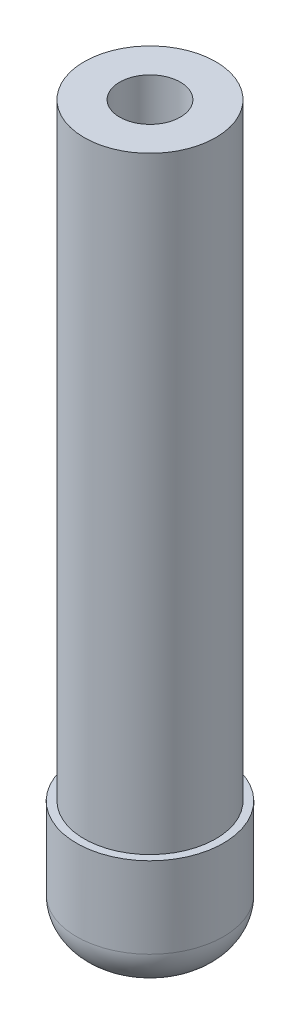
ISO-10303-21;
HEADER;
FILE_DESCRIPTION(('STEP AP214'),'2;1');
FILE_NAME('part.step','',(''),(''),'','','');
FILE_SCHEMA(('AUTOMOTIVE_DESIGN { 1 0 10303 214 1 1 1 1 }'));
ENDSEC;
DATA;
#1=APPLICATION_CONTEXT('core data for automotive mechanical design processes');
#2=APPLICATION_PROTOCOL_DEFINITION('international standard','automotive_design',2000,#1);
#3=PRODUCT_CONTEXT('',#1,'mechanical');
#4=PRODUCT('Part','Part','',(#3));
#5=PRODUCT_RELATED_PRODUCT_CATEGORY('part','',(#4));
#6=PRODUCT_DEFINITION_FORMATION('','',#4);
#7=PRODUCT_DEFINITION_CONTEXT('part definition',#1,'design');
#8=PRODUCT_DEFINITION('design','',#6,#7);
#9=PRODUCT_DEFINITION_SHAPE('','',#8);
#10=(LENGTH_UNIT() NAMED_UNIT(*) SI_UNIT(.MILLI.,.METRE.));
#11=(NAMED_UNIT(*) PLANE_ANGLE_UNIT() SI_UNIT($,.RADIAN.));
#12=(NAMED_UNIT(*) SI_UNIT($,.STERADIAN.) SOLID_ANGLE_UNIT());
#13=UNCERTAINTY_MEASURE_WITH_UNIT(LENGTH_MEASURE(1.E-05),#10,'distance_accuracy_value','');
#14=(GEOMETRIC_REPRESENTATION_CONTEXT(3) GLOBAL_UNCERTAINTY_ASSIGNED_CONTEXT((#13)) GLOBAL_UNIT_ASSIGNED_CONTEXT((#10,
#11,#12)) REPRESENTATION_CONTEXT('',''));
#15=CARTESIAN_POINT('',(0.,0.,0.));
#16=DIRECTION('',(0.,0.,1.));
#17=DIRECTION('',(1.,0.,0.));
#18=AXIS2_PLACEMENT_3D('',#15,#16,#17);
#19=CARTESIAN_POINT('',(0.,-10.,0.));
#20=DIRECTION('',(0.,1.,0.));
#21=DIRECTION('',(0.,0.,1.));
#22=AXIS2_PLACEMENT_3D('',#19,#20,#21);
#23=CYLINDRICAL_SURFACE('',#22,7.25);
#24=CARTESIAN_POINT('',(0.,0.,0.));
#25=DIRECTION('',(0.,-1.,0.));
#26=DIRECTION('',(0.,0.,-1.));
#27=AXIS2_PLACEMENT_3D('',#24,#25,#26);
#28=CIRCLE('',#27,7.25);
#29=CARTESIAN_POINT('',(0.,0.,-7.25));
#30=VERTEX_POINT('',#29);
#31=EDGE_CURVE('E100',#30,#30,#28,.T.);
#32=ORIENTED_EDGE('',*,*,#31,.T.);
#33=EDGE_LOOP('',(#32));
#34=FACE_BOUND('',#33,.T.);
#35=DIRECTION('',(0.,1.,0.));
#36=VECTOR('',#35,1.);
#37=CARTESIAN_POINT('',(2.,-10.,-6.96867993238318));
#38=LINE('',#37,#36);
#39=CARTESIAN_POINT('',(2.,-6.25,-6.96867993238318));
#40=VERTEX_POINT('',#39);
#41=CARTESIAN_POINT('',(2.00000008416036,-8.,-6.96852335366192));
#42=VERTEX_POINT('',#41);
#43=EDGE_CURVE('E95',#40,#42,#38,.F.);
#44=ORIENTED_EDGE('',*,*,#43,.F.);
#45=CARTESIAN_POINT('',(0.,-6.25,0.));
#46=DIRECTION('',(0.,1.,0.));
#47=DIRECTION('',(0.,0.,1.));
#48=AXIS2_PLACEMENT_3D('',#45,#46,#47);
#49=CIRCLE('',#48,7.25);
#50=CARTESIAN_POINT('',(-2.,-6.25,-6.96867993238318));
#51=VERTEX_POINT('',#50);
#52=EDGE_CURVE('E104',#51,#40,#49,.F.);
#53=ORIENTED_EDGE('',*,*,#52,.F.);
#54=DIRECTION('',(0.,1.,0.));
#55=VECTOR('',#54,1.);
#56=CARTESIAN_POINT('',(-2.,-10.,-6.96867993238318));
#57=LINE('',#56,#55);
#58=CARTESIAN_POINT('',(-2.00000008416675,-8.,-6.9685233536601));
#59=VERTEX_POINT('',#58);
#60=EDGE_CURVE('E115',#59,#51,#57,.T.);
#61=ORIENTED_EDGE('',*,*,#60,.F.);
#62=CARTESIAN_POINT('',(0.,-8.,-7.25));
#63=CARTESIAN_POINT('',(0.949022765797629,-8.,-7.25));
#64=CARTESIAN_POINT('',(1.89767217543963,-8.,-7.06130190011471));
#65=CARTESIAN_POINT('',(3.65123759385418,-8.,-6.33495132129895));
#66=CARTESIAN_POINT('',(4.45546373040692,-8.,-5.79758459679802));
#67=CARTESIAN_POINT('',(5.79758459679802,-8.,-4.45546373040692));
#68=CARTESIAN_POINT('',(6.3349513212989,-8.,-3.6512375938543));
#69=CARTESIAN_POINT('',(7.06130190011476,-8.,-1.89767217543949));
#70=CARTESIAN_POINT('',(7.25,-8.,-0.949022765797199));
#71=CARTESIAN_POINT('',(7.25,-8.,0.949022765797198));
#72=CARTESIAN_POINT('',(7.06130190011474,-8.,1.89767217543955));
#73=CARTESIAN_POINT('',(6.33495132129892,-8.,3.65123759385426));
#74=CARTESIAN_POINT('',(5.79758459679801,-8.,4.45546373040693));
#75=CARTESIAN_POINT('',(4.45546373040692,-8.,5.79758459679802));
#76=CARTESIAN_POINT('',(3.65123759385425,-8.,6.33495132129892));
#77=CARTESIAN_POINT('',(1.89767217543957,-8.,7.06130190011473));
#78=CARTESIAN_POINT('',(0.949022765797199,-8.,7.25));
#79=CARTESIAN_POINT('',(-0.949022765797197,-8.,7.25));
#80=CARTESIAN_POINT('',(-1.89767217543963,-8.,7.0613019001147));
#81=CARTESIAN_POINT('',(-3.65123759385415,-8.,6.33495132129896));
#82=CARTESIAN_POINT('',(-4.45546373040693,-8.,5.79758459679801));
#83=CARTESIAN_POINT('',(-5.79758459679802,-8.,4.45546373040692));
#84=CARTESIAN_POINT('',(-6.33495132129889,-8.,3.65123759385432));
#85=CARTESIAN_POINT('',(-7.06130190011476,-8.,1.89767217543951));
#86=CARTESIAN_POINT('',(-7.25,-8.,0.949022765797188));
#87=CARTESIAN_POINT('',(-7.25,-8.,-0.949022765797211));
#88=CARTESIAN_POINT('',(-7.06130190011474,-8.,-1.89767217543955));
#89=CARTESIAN_POINT('',(-6.33495132129893,-8.,-3.65123759385423));
#90=CARTESIAN_POINT('',(-5.79758459679803,-8.,-4.45546373040691));
#91=CARTESIAN_POINT('',(-4.45546373040694,-8.,-5.797584596798));
#92=CARTESIAN_POINT('',(-3.65123759385425,-8.,-6.33495132129892));
#93=CARTESIAN_POINT('',(-1.89767217543957,-8.,-7.06130190011473));
#94=CARTESIAN_POINT('',(-0.94902276579763,-8.,-7.25));
#95=CARTESIAN_POINT('',(0.,-8.,-7.25));
#96=(BOUNDED_CURVE() B_SPLINE_CURVE(3,(#62,#63,#64,#65,#66,#67,#68,#69,#70,#71,#72,#73,#74,#75,
#76,#77,#78,#79,#80,#81,#82,#83,#84,#85,#86,#87,#88,#89,#90,#91,#92,#93,#94,#95),.UNSPECIFIED.,
.T.,.F.) B_SPLINE_CURVE_WITH_KNOTS((4,2,2,2,2,2,2,2,2,2,2,2,2,2,2,2,4),(0.,0.392699081698724,
0.785398163397448,1.17809724509617,1.5707963267949,1.96349540849362,2.35619449019234,
2.74889357189107,3.14159265358979,3.53429173528852,3.92699081698724,4.31968989868597,
4.71238898038469,5.10508806208341,5.49778714378214,5.89048622548086,6.28318530717959),
.UNSPECIFIED.) CURVE() GEOMETRIC_REPRESENTATION_ITEM() RATIONAL_B_SPLINE_CURVE((1.,1.,1.,1.,1.,
1.,1.,1.,1.,1.,1.,1.,1.,1.,1.,1.,1.,1.,1.,1.,1.,1.,1.,1.,1.,1.,1.,1.,1.,1.,1.,1.,1.,1.)) REPRESENTATION_ITEM(''));
#97=EDGE_CURVE('E12',#59,#42,#96,.F.);
#98=ORIENTED_EDGE('',*,*,#97,.T.);
#99=EDGE_LOOP('',(#44,#53,#61,#98));
#100=FACE_BOUND('',#99,.T.);
#101=ADVANCED_FACE('F38',(#34,#100),#23,.T.);
#102=CARTESIAN_POINT('',(0.,-12.,-3.25));
#103=CARTESIAN_POINT('',(0.425423998461006,-12.,-3.25));
#104=CARTESIAN_POINT('',(0.850680630369499,-12.,-3.16541119660319));
#105=CARTESIAN_POINT('',(1.63676168000358,-12.,-2.83980576472018));
#106=CARTESIAN_POINT('',(1.9972768446652,-12.,-2.59891723304745));
#107=CARTESIAN_POINT('',(2.59891723304735,-12.,-1.99727684466511));
#108=CARTESIAN_POINT('',(2.83980576472021,-12.,-1.6367616800036));
#109=CARTESIAN_POINT('',(3.16541119660316,-12.,-0.850680630369477));
#110=CARTESIAN_POINT('',(3.25,-12.,-0.425423998460813));
#111=CARTESIAN_POINT('',(3.25,-12.,0.425423998460813));
#112=CARTESIAN_POINT('',(3.16541119660306,-12.,0.850680630369433));
#113=CARTESIAN_POINT('',(2.8398057647203,-12.,1.63676168000365));
#114=CARTESIAN_POINT('',(2.59891723304745,-12.,1.99727684466511));
#115=CARTESIAN_POINT('',(1.99727684466511,-12.,2.59891723304745));
#116=CARTESIAN_POINT('',(1.63676168000366,-12.,2.83980576472021));
#117=CARTESIAN_POINT('',(0.850680630369436,-12.,3.16541119660316));
#118=CARTESIAN_POINT('',(0.425423998460814,-12.,3.25));
#119=CARTESIAN_POINT('',(-0.425423998460813,-12.,3.25));
#120=CARTESIAN_POINT('',(-0.850680630369474,-12.,3.16541119660316));
#121=CARTESIAN_POINT('',(-1.6367616800036,-12.,2.83980576472021));
#122=CARTESIAN_POINT('',(-1.99727684466511,-12.,2.59891723304745));
#123=CARTESIAN_POINT('',(-2.59891723304745,-12.,1.99727684466511));
#124=CARTESIAN_POINT('',(-2.83980576472011,-12.,1.63676168000361));
#125=CARTESIAN_POINT('',(-3.16541119660325,-12.,0.850680630369482));
#126=CARTESIAN_POINT('',(-3.25,-12.,0.425423998460808));
#127=CARTESIAN_POINT('',(-3.25,-12.,-0.425423998460819));
#128=CARTESIAN_POINT('',(-3.16541119660316,-12.,-0.850680630369473));
#129=CARTESIAN_POINT('',(-2.83980576472021,-12.,-1.6367616800036));
#130=CARTESIAN_POINT('',(-2.59891723304736,-12.,-1.9972768446652));
#131=CARTESIAN_POINT('',(-1.99727684466521,-12.,-2.59891723304735));
#132=CARTESIAN_POINT('',(-1.63676168000361,-12.,-2.83980576472021));
#133=CARTESIAN_POINT('',(-0.850680630369482,-12.,-3.16541119660316));
#134=CARTESIAN_POINT('',(-0.425423998461007,-12.,-3.25));
#135=CARTESIAN_POINT('',(0.,-12.,-3.25));
#136=CARTESIAN_POINT('',(0.,-12.,-7.25));
#137=CARTESIAN_POINT('',(0.949022765797629,-12.0000000000007,-7.25000000000037));
#138=CARTESIAN_POINT('',(1.8976721754395,-12.,-7.06130190011464));
#139=CARTESIAN_POINT('',(3.6512375938543,-12.,-6.33495132129902));
#140=CARTESIAN_POINT('',(4.45546373040692,-12.,-5.79758459679802));
#141=CARTESIAN_POINT('',(5.79758459679802,-12.,-4.45546373040692));
#142=CARTESIAN_POINT('',(6.33495132129872,-12.,-3.65123759385423));
#143=CARTESIAN_POINT('',(7.06130190011494,-12.,-1.89767217543957));
#144=CARTESIAN_POINT('',(7.25,-12.,-0.949022765797199));
#145=CARTESIAN_POINT('',(7.25,-12.,0.949022765797198));
#146=CARTESIAN_POINT('',(7.06130190011457,-12.,1.89767217543948));
#147=CARTESIAN_POINT('',(6.33495132129909,-12.,3.65123759385433));
#148=CARTESIAN_POINT('',(5.79758459679801,-12.,4.45546373040693));
#149=CARTESIAN_POINT('',(4.45546373040692,-12.,5.79758459679802));
#150=CARTESIAN_POINT('',(3.65123759385424,-12.,6.3349513212989));
#151=CARTESIAN_POINT('',(1.89767217543958,-12.,7.06130190011475));
#152=CARTESIAN_POINT('',(0.949022765797199,-12.,7.25));
#153=CARTESIAN_POINT('',(-0.949022765797197,-12.,7.25));
#154=CARTESIAN_POINT('',(-1.89767217543974,-12.,7.06130190011494));
#155=CARTESIAN_POINT('',(-3.65123759385404,-12.,6.33495132129872));
#156=CARTESIAN_POINT('',(-4.45546373040693,-12.,5.79758459679801));
#157=CARTESIAN_POINT('',(-5.79758459679802,-12.,4.45546373040692));
#158=CARTESIAN_POINT('',(-6.33495132129835,-12.,3.65123759385424));
#159=CARTESIAN_POINT('',(-7.06130190011531,-12.,1.89767217543958));
#160=CARTESIAN_POINT('',(-7.25,-12.,0.949022765797188));
#161=CARTESIAN_POINT('',(-7.25,-12.,-0.949022765797211));
#162=CARTESIAN_POINT('',(-7.06130190011494,-12.,-1.89767217543956));
#163=CARTESIAN_POINT('',(-6.33495132129872,-12.,-3.65123759385422));
#164=CARTESIAN_POINT('',(-5.79758459679803,-12.,-4.45546373040691));
#165=CARTESIAN_POINT('',(-4.45546373040694,-12.,-5.797584596798));
#166=CARTESIAN_POINT('',(-3.65123759385424,-12.,-6.33495132129872));
#167=CARTESIAN_POINT('',(-1.89767217543958,-12.,-7.06130190011494));
#168=CARTESIAN_POINT('',(-0.94902276579763,-11.9999999999993,-7.24999999999963));
#169=CARTESIAN_POINT('',(0.,-12.,-7.25));
#170=CARTESIAN_POINT('',(0.,-8.,-7.25));
#171=CARTESIAN_POINT('',(0.949022765797629,-8.,-7.25));
#172=CARTESIAN_POINT('',(1.89767217543963,-8.,-7.06130190011471));
#173=CARTESIAN_POINT('',(3.65123759385418,-8.,-6.33495132129895));
#174=CARTESIAN_POINT('',(4.45546373040692,-8.,-5.79758459679802));
#175=CARTESIAN_POINT('',(5.79758459679802,-8.,-4.45546373040692));
#176=CARTESIAN_POINT('',(6.3349513212989,-8.,-3.6512375938543));
#177=CARTESIAN_POINT('',(7.06130190011476,-8.,-1.89767217543949));
#178=CARTESIAN_POINT('',(7.25,-8.,-0.949022765797199));
#179=CARTESIAN_POINT('',(7.25,-8.,0.949022765797198));
#180=CARTESIAN_POINT('',(7.06130190011474,-8.,1.89767217543955));
#181=CARTESIAN_POINT('',(6.33495132129892,-8.,3.65123759385426));
#182=CARTESIAN_POINT('',(5.79758459679801,-8.,4.45546373040693));
#183=CARTESIAN_POINT('',(4.45546373040692,-8.,5.79758459679802));
#184=CARTESIAN_POINT('',(3.65123759385425,-8.,6.33495132129892));
#185=CARTESIAN_POINT('',(1.89767217543957,-8.,7.06130190011473));
#186=CARTESIAN_POINT('',(0.949022765797199,-8.,7.25));
#187=CARTESIAN_POINT('',(-0.949022765797197,-8.,7.25));
#188=CARTESIAN_POINT('',(-1.89767217543963,-8.,7.0613019001147));
#189=CARTESIAN_POINT('',(-3.65123759385415,-8.,6.33495132129896));
#190=CARTESIAN_POINT('',(-4.45546373040693,-8.,5.79758459679801));
#191=CARTESIAN_POINT('',(-5.79758459679802,-8.,4.45546373040692));
#192=CARTESIAN_POINT('',(-6.33495132129889,-8.,3.65123759385432));
#193=CARTESIAN_POINT('',(-7.06130190011476,-8.,1.89767217543951));
#194=CARTESIAN_POINT('',(-7.25,-8.,0.949022765797188));
#195=CARTESIAN_POINT('',(-7.25,-8.,-0.949022765797211));
#196=CARTESIAN_POINT('',(-7.06130190011474,-8.,-1.89767217543955));
#197=CARTESIAN_POINT('',(-6.33495132129893,-8.,-3.65123759385423));
#198=CARTESIAN_POINT('',(-5.79758459679803,-8.,-4.45546373040691));
#199=CARTESIAN_POINT('',(-4.45546373040694,-8.,-5.797584596798));
#200=CARTESIAN_POINT('',(-3.65123759385425,-8.,-6.33495132129892));
#201=CARTESIAN_POINT('',(-1.89767217543957,-8.,-7.06130190011473));
#202=CARTESIAN_POINT('',(-0.94902276579763,-8.,-7.25));
#203=CARTESIAN_POINT('',(0.,-8.,-7.25));
#204=(BOUNDED_SURFACE() B_SPLINE_SURFACE(2,3,((#102,#103,#104,#105,#106,#107,#108,#109,#110,
#111,#112,#113,#114,#115,#116,#117,#118,#119,#120,#121,#122,#123,#124,#125,#126,#127,#128,#129,
#130,#131,#132,#133,#134,#135),(#136,#137,#138,#139,#140,#141,#142,#143,#144,#145,#146,#147,
#148,#149,#150,#151,#152,#153,#154,#155,#156,#157,#158,#159,#160,#161,#162,#163,#164,#165,#166,
#167,#168,#169),(#170,#171,#172,#173,#174,#175,#176,#177,#178,#179,#180,#181,#182,#183,#184,
#185,#186,#187,#188,#189,#190,#191,#192,#193,#194,#195,#196,#197,#198,#199,#200,#201,#202,
#203)),.UNSPECIFIED.,.F.,.T.,.F.) B_SPLINE_SURFACE_WITH_KNOTS((3,3),(4,2,2,2,2,2,2,2,2,2,2,2,2,
2,2,2,4),(0.,1.),(0.,0.392699081698724,0.785398163397448,1.17809724509617,1.5707963267949,
1.96349540849362,2.35619449019234,2.74889357189107,3.14159265358979,3.53429173528852,
3.92699081698724,4.31968989868597,4.71238898038469,5.10508806208341,5.49778714378214,
5.89048622548086,6.28318530717959),
.UNSPECIFIED.) GEOMETRIC_REPRESENTATION_ITEM() RATIONAL_B_SPLINE_SURFACE(((1.,1.,1.,1.,1.,1.,1.,
1.,1.,1.,1.,1.,1.,1.,1.,1.,1.,1.,1.,1.,1.,1.,1.,1.,1.,1.,1.,1.,1.,1.,1.,1.,1.,1.),
(0.666666666666667,0.666666666666667,0.666666666666667,0.666666666666667,0.666666666666667,
0.666666666666667,0.666666666666666,0.666666666666666,0.666666666666667,0.666666666666667,
0.666666666666667,0.666666666666667,0.666666666666666,0.666666666666666,0.666666666666667,
0.666666666666667,0.666666666666667,0.666666666666667,0.666666666666667,0.666666666666667,
0.666666666666666,0.666666666666666,0.666666666666667,0.666666666666667,0.666666666666666,
0.666666666666666,0.666666666666667,0.666666666666667,0.666666666666666,0.666666666666666,
0.666666666666667,0.666666666666667,0.666666666666667,0.666666666666667),(1.,1.,1.,1.,1.,1.,1.,
1.,1.,1.,1.,1.,1.,1.,1.,1.,1.,1.,1.,1.,1.,1.,1.,1.,1.,1.,1.,1.,1.,1.,1.,1.,1.,1.))) REPRESENTATION_ITEM('') SURFACE());
#205=CARTESIAN_POINT('',(0.,-12.,-3.25));
#206=CARTESIAN_POINT('',(-0.0531768229784522,-12.,-3.25000008603455));
#207=CARTESIAN_POINT('',(-0.106352582379698,-12.,-3.2486783641151));
#208=CARTESIAN_POINT('',(-0.212573677462247,-12.,-3.24341637998731));
#209=CARTESIAN_POINT('',(-0.265619015236641,-12.,-3.2394761600813));
#210=CARTESIAN_POINT('',(-0.371453651768639,-12.,-3.22900215948038));
#211=CARTESIAN_POINT('',(-0.424242945888606,-12.,-3.22246833198456));
#212=CARTESIAN_POINT('',(-0.529440623761362,-12.,-3.20683207879884));
#213=CARTESIAN_POINT('',(-0.581849000768205,-12.,-3.19772960773205));
#214=CARTESIAN_POINT('',(-0.686159759651296,-12.,-3.17698090988573));
#215=CARTESIAN_POINT('',(-0.738062141527544,-12.,-3.16533468310619));
#216=CARTESIAN_POINT('',(-0.841235876885507,-12.,-3.13952327660689));
#217=CARTESIAN_POINT('',(-0.89250724149908,-12.,-3.12535814139182));
#218=CARTESIAN_POINT('',(-0.994293846242282,-12.,-3.09453373941932));
#219=CARTESIAN_POINT('',(-1.04480909999964,-12.,-3.07787451767363));
#220=CARTESIAN_POINT('',(-1.1449585560669,-12.,-3.04208673531296));
#221=CARTESIAN_POINT('',(-1.19459274413019,-12.,-3.02295813481002));
#222=CARTESIAN_POINT('',(-1.2928495662429,-12.,-2.98225882651334));
#223=CARTESIAN_POINT('',(-1.34147220029233,-12.,-2.9606881187196));
#224=CARTESIAN_POINT('',(-1.43759434346581,-12.,-2.91517754269374));
#225=CARTESIAN_POINT('',(-1.48509387072103,-12.,-2.89123771274054));
#226=CARTESIAN_POINT('',(-1.57886401255567,-12.,-2.84105985832017));
#227=CARTESIAN_POINT('',(-1.62513460494325,-12.,-2.81482179238864));
#228=CARTESIAN_POINT('',(-1.71634087445363,-12.,-2.76011836367667));
#229=CARTESIAN_POINT('',(-1.76127652797832,-12.,-2.7316529615552));
#230=CARTESIAN_POINT('',(-1.84970691403401,-12.,-2.67256566664996));
#231=CARTESIAN_POINT('',(-1.89320164656501,-12.,-2.6419437738662));
#232=CARTESIAN_POINT('',(-1.97864415297975,-12.,-2.57861426408987));
#233=CARTESIAN_POINT('',(-2.02059195417925,-12.,-2.54590668395428));
#234=CARTESIAN_POINT('',(-2.10283452659361,-12.,-2.47847660271317));
#235=CARTESIAN_POINT('',(-2.14312932762409,-12.,-2.44375413797797));
#236=CARTESIAN_POINT('',(-2.2219599690053,-12.,-2.37236500071283));
#237=CARTESIAN_POINT('',(-2.2604957809294,-12.,-2.33569829678316));
#238=CARTESIAN_POINT('',(-2.33569829678317,-12.,-2.26049578092939));
#239=CARTESIAN_POINT('',(-2.37236500071284,-12.,-2.22195996900529));
#240=CARTESIAN_POINT('',(-2.44375413797799,-12.,-2.14312932762408));
#241=CARTESIAN_POINT('',(-2.47847660271318,-12.,-2.10283452659359));
#242=CARTESIAN_POINT('',(-2.54590668395429,-12.,-2.02059195417924));
#243=CARTESIAN_POINT('',(-2.57861426408988,-12.,-1.97864415297976));
#244=CARTESIAN_POINT('',(-2.64194377386621,-12.,-1.89320164656498));
#245=CARTESIAN_POINT('',(-2.67256566664996,-12.,-1.84970691403391));
#246=CARTESIAN_POINT('',(-2.73165296155521,-12.,-1.76127652797839));
#247=CARTESIAN_POINT('',(-2.76011836367672,-12.,-1.71634087445393));
#248=CARTESIAN_POINT('',(-2.81482179238861,-12.,-1.62513460494292));
#249=CARTESIAN_POINT('',(-2.84105985832001,-12.,-1.57886401255449));
#250=CARTESIAN_POINT('',(-2.89123771274071,-12.,-1.48509387072219));
#251=CARTESIAN_POINT('',(-2.91517754269435,-12.,-1.43759434347018));
#252=CARTESIAN_POINT('',(-2.96068811871899,-12.,-1.34147220028795));
#253=CARTESIAN_POINT('',(-2.98225882651106,-12.,-1.29284956622658));
#254=CARTESIAN_POINT('',(-3.02295813481231,-12.,-1.1945927441465));
#255=CARTESIAN_POINT('',(-3.0420867353215,-12.,-1.14495855612778));
#256=CARTESIAN_POINT('',(-3.07787451766511,-12.,-1.04480909993873));
#257=CARTESIAN_POINT('',(-3.09453373938748,-12.,-0.994293846014999));
#258=CARTESIAN_POINT('',(-3.12535814142366,-12.,-0.892507241726297));
#259=CARTESIAN_POINT('',(-3.13952327672572,-12.,-0.841235877733606));
#260=CARTESIAN_POINT('',(-3.16533468298736,-12.,-0.738062140679319));
#261=CARTESIAN_POINT('',(-3.17698090944223,-12.,-0.686159756485814));
#262=CARTESIAN_POINT('',(-3.19772960817556,-12.,-0.58184900393354));
#263=CARTESIAN_POINT('',(-3.20683208045401,-12.,-0.529440635574771));
#264=CARTESIAN_POINT('',(-3.22246833032942,-12.,-0.424242934075242));
#265=CARTESIAN_POINT('',(-3.22900215330336,-12.,-0.371453607681149));
#266=CARTESIAN_POINT('',(-3.23947616625822,-12.,-0.265619059323185));
#267=CARTESIAN_POINT('',(-3.24341640303967,-12.,-0.212573841994193));
#268=CARTESIAN_POINT('',(-3.24867834106237,-12.,-0.106352417845001));
#269=CARTESIAN_POINT('',(-3.25,-12.,-0.0531762089225033));
#270=CARTESIAN_POINT('',(-3.25,-12.,0.0531762089224933));
#271=CARTESIAN_POINT('',(-3.24867834106237,-12.,0.106352417844992));
#272=CARTESIAN_POINT('',(-3.24341640303968,-12.,0.212573841994185));
#273=CARTESIAN_POINT('',(-3.23947616625823,-12.,0.265619059323177));
#274=CARTESIAN_POINT('',(-3.22900215330337,-12.,0.371453607681143));
#275=CARTESIAN_POINT('',(-3.22246833032944,-12.,0.424242934075237));
#276=CARTESIAN_POINT('',(-3.20683208045404,-12.,0.529440635574768));
#277=CARTESIAN_POINT('',(-3.19772960817559,-12.,0.581849003933538));
#278=CARTESIAN_POINT('',(-3.17698090944227,-12.,0.686159756485815));
#279=CARTESIAN_POINT('',(-3.1653346829874,-12.,0.738062140679322));
#280=CARTESIAN_POINT('',(-3.13952327672576,-12.,0.84123587773361));
#281=CARTESIAN_POINT('',(-3.1253581414237,-12.,0.892507241726303));
#282=CARTESIAN_POINT('',(-3.09453373938752,-12.,0.994293846015007));
#283=CARTESIAN_POINT('',(-3.07787451766514,-12.,1.04480909993873));
#284=CARTESIAN_POINT('',(-3.04208673532151,-12.,1.14495855612779));
#285=CARTESIAN_POINT('',(-3.02295813481232,-12.,1.1945927441465));
#286=CARTESIAN_POINT('',(-2.98225882651104,-12.,1.29284956622659));
#287=CARTESIAN_POINT('',(-2.96068811871897,-12.,1.34147220028796));
#288=CARTESIAN_POINT('',(-2.91517754269432,-12.,1.43759434347018));
#289=CARTESIAN_POINT('',(-2.89123771274068,-12.,1.48509387072219));
#290=CARTESIAN_POINT('',(-2.84105985831998,-12.,1.57886401255448));
#291=CARTESIAN_POINT('',(-2.81482179238858,-12.,1.62513460494291));
#292=CARTESIAN_POINT('',(-2.7601183636767,-12.,1.71634087445391));
#293=CARTESIAN_POINT('',(-2.7316529615552,-12.,1.76127652797836));
#294=CARTESIAN_POINT('',(-2.67256566664996,-12.,1.84970691403388));
#295=CARTESIAN_POINT('',(-2.64194377386621,-12.,1.89320164656494));
#296=CARTESIAN_POINT('',(-2.57861426408989,-12.,1.97864415297973));
#297=CARTESIAN_POINT('',(-2.54590668395431,-12.,2.02059195417921));
#298=CARTESIAN_POINT('',(-2.4784766027132,-12.,2.10283452659356));
#299=CARTESIAN_POINT('',(-2.443754137978,-12.,2.14312932762405));
#300=CARTESIAN_POINT('',(-2.37236500071285,-12.,2.22195996900527));
#301=CARTESIAN_POINT('',(-2.33569829678317,-12.,2.26049578092938));
#302=CARTESIAN_POINT('',(-2.26049578092939,-12.,2.33569829678317));
#303=CARTESIAN_POINT('',(-2.22195996900528,-12.,2.37236500071285));
#304=CARTESIAN_POINT('',(-2.14312932762405,-12.,2.44375413797801));
#305=CARTESIAN_POINT('',(-2.10283452659356,-12.,2.47847660271321));
#306=CARTESIAN_POINT('',(-2.02059195417921,-12.,2.54590668395432));
#307=CARTESIAN_POINT('',(-1.97864415297973,-12.,2.57861426408991));
#308=CARTESIAN_POINT('',(-1.89320164656494,-12.,2.64194377386624));
#309=CARTESIAN_POINT('',(-1.84970691403388,-12.,2.67256566664999));
#310=CARTESIAN_POINT('',(-1.76127652797836,-12.,2.73165296155524));
#311=CARTESIAN_POINT('',(-1.71634087445391,-12.,2.76011836367674));
#312=CARTESIAN_POINT('',(-1.6251346049429,-12.,2.81482179238862));
#313=CARTESIAN_POINT('',(-1.57886401255448,-12.,2.84105985832003));
#314=CARTESIAN_POINT('',(-1.48509387072218,-12.,2.89123771274072));
#315=CARTESIAN_POINT('',(-1.43759434347017,-12.,2.91517754269436));
#316=CARTESIAN_POINT('',(-1.34147220028795,-12.,2.96068811871899));
#317=CARTESIAN_POINT('',(-1.29284956622658,-12.,2.98225882651106));
#318=CARTESIAN_POINT('',(-1.1945927441465,-12.,3.02295813481231));
#319=CARTESIAN_POINT('',(-1.14495855612779,-12.,3.0420867353215));
#320=CARTESIAN_POINT('',(-1.04480909993873,-12.,3.07787451766511));
#321=CARTESIAN_POINT('',(-0.994293846015,-12.,3.09453373938748));
#322=CARTESIAN_POINT('',(-0.892507241726297,-12.,3.12535814142366));
#323=CARTESIAN_POINT('',(-0.841235877733606,-12.,3.13952327672572));
#324=CARTESIAN_POINT('',(-0.738062140679318,-12.,3.16533468298736));
#325=CARTESIAN_POINT('',(-0.686159756485813,-12.,3.17698090944223));
#326=CARTESIAN_POINT('',(-0.581849003933537,-12.,3.19772960817556));
#327=CARTESIAN_POINT('',(-0.529440635574768,-12.,3.20683208045401));
#328=CARTESIAN_POINT('',(-0.424242934075238,-12.,3.22246833032942));
#329=CARTESIAN_POINT('',(-0.371453607681146,-12.,3.22900215330336));
#330=CARTESIAN_POINT('',(-0.265619059323182,-12.,3.23947616625822));
#331=CARTESIAN_POINT('',(-0.212573841994189,-12.,3.24341640303967));
#332=CARTESIAN_POINT('',(-0.106352417844996,-12.,3.24867834106237));
#333=CARTESIAN_POINT('',(-0.0531762089224979,-12.,3.25));
#334=CARTESIAN_POINT('',(0.0531762089224982,-12.,3.25));
#335=CARTESIAN_POINT('',(0.106352417844996,-12.,3.24867834106237));
#336=CARTESIAN_POINT('',(0.212573841994187,-12.,3.24341640303967));
#337=CARTESIAN_POINT('',(0.265619059323178,-12.,3.23947616625822));
#338=CARTESIAN_POINT('',(0.37145360768114,-12.,3.22900215330335));
#339=CARTESIAN_POINT('',(0.424242934075231,-12.,3.22246833032942));
#340=CARTESIAN_POINT('',(0.529440635574758,-12.,3.20683208045401));
#341=CARTESIAN_POINT('',(0.581849003933526,-12.,3.19772960817556));
#342=CARTESIAN_POINT('',(0.6861597564858,-12.,3.17698090944223));
#343=CARTESIAN_POINT('',(0.738062140679305,-12.,3.16533468298736));
#344=CARTESIAN_POINT('',(0.841235877733592,-12.,3.13952327672572));
#345=CARTESIAN_POINT('',(0.892507241726285,-12.,3.12535814142366));
#346=CARTESIAN_POINT('',(0.99429384601499,-12.,3.09453373938748));
#347=CARTESIAN_POINT('',(1.04480909993872,-12.,3.0778745176651));
#348=CARTESIAN_POINT('',(1.14495855612779,-12.,3.04208673532149));
#349=CARTESIAN_POINT('',(1.1945927441465,-12.,3.02295813481231));
#350=CARTESIAN_POINT('',(1.29284956622659,-12.,2.98225882651106));
#351=CARTESIAN_POINT('',(1.34147220028797,-12.,2.96068811871899));
#352=CARTESIAN_POINT('',(1.43759434347019,-12.,2.91517754269436));
#353=CARTESIAN_POINT('',(1.48509387072221,-12.,2.89123771274071));
#354=CARTESIAN_POINT('',(1.5788640125545,-12.,2.84105985832002));
#355=CARTESIAN_POINT('',(1.62513460494293,-12.,2.81482179238862));
#356=CARTESIAN_POINT('',(1.71634087445393,-12.,2.76011836367674));
#357=CARTESIAN_POINT('',(1.76127652797838,-12.,2.73165296155524));
#358=CARTESIAN_POINT('',(1.8497069140339,-12.,2.67256566664999));
#359=CARTESIAN_POINT('',(1.89320164656496,-12.,2.64194377386624));
#360=CARTESIAN_POINT('',(1.97864415297974,-12.,2.57861426408992));
#361=CARTESIAN_POINT('',(2.02059195417921,-12.,2.54590668395433));
#362=CARTESIAN_POINT('',(2.10283452659356,-12.,2.47847660271321));
#363=CARTESIAN_POINT('',(2.14312932762405,-12.,2.44375413797801));
#364=CARTESIAN_POINT('',(2.22195996900527,-12.,2.37236500071285));
#365=CARTESIAN_POINT('',(2.26049578092938,-12.,2.33569829678317));
#366=CARTESIAN_POINT('',(2.33569829678317,-12.,2.26049578092939));
#367=CARTESIAN_POINT('',(2.37236500071285,-12.,2.22195996900528));
#368=CARTESIAN_POINT('',(2.44375413797801,-12.,2.14312932762406));
#369=CARTESIAN_POINT('',(2.47847660271322,-12.,2.10283452659357));
#370=CARTESIAN_POINT('',(2.54590668395434,-12.,2.02059195417922));
#371=CARTESIAN_POINT('',(2.57861426408993,-12.,1.97864415297974));
#372=CARTESIAN_POINT('',(2.64194377386627,-12.,1.89320164656496));
#373=CARTESIAN_POINT('',(2.67256566665002,-12.,1.8497069140339));
#374=CARTESIAN_POINT('',(2.73165296155528,-12.,1.76127652797838));
#375=CARTESIAN_POINT('',(2.76011836367678,-12.,1.71634087445393));
#376=CARTESIAN_POINT('',(2.81482179238866,-12.,1.62513460494293));
#377=CARTESIAN_POINT('',(2.84105985832007,-12.,1.5788640125545));
#378=CARTESIAN_POINT('',(2.89123771274075,-12.,1.4850938707222));
#379=CARTESIAN_POINT('',(2.91517754269439,-12.,1.43759434347019));
#380=CARTESIAN_POINT('',(2.96068811871901,-12.,1.34147220028796));
#381=CARTESIAN_POINT('',(2.98225882651107,-12.,1.29284956622659));
#382=CARTESIAN_POINT('',(3.0229581348123,-12.,1.1945927441465));
#383=CARTESIAN_POINT('',(3.04208673532147,-12.,1.14495855612778));
#384=CARTESIAN_POINT('',(3.07787451766507,-12.,1.04480909993872));
#385=CARTESIAN_POINT('',(3.09453373938744,-12.,0.994293846014987));
#386=CARTESIAN_POINT('',(3.12535814142362,-12.,0.892507241726282));
#387=CARTESIAN_POINT('',(3.13952327672568,-12.,0.841235877733589));
#388=CARTESIAN_POINT('',(3.16533468298732,-12.,0.738062140679302));
#389=CARTESIAN_POINT('',(3.17698090944219,-12.,0.686159756485797));
#390=CARTESIAN_POINT('',(3.19772960817553,-12.,0.581849003933524));
#391=CARTESIAN_POINT('',(3.20683208045398,-12.,0.529440635574756));
#392=CARTESIAN_POINT('',(3.2224683303294,-12.,0.424242934075229));
#393=CARTESIAN_POINT('',(3.22900215330334,-12.,0.371453607681139));
#394=CARTESIAN_POINT('',(3.23947616625821,-12.,0.265619059323178));
#395=CARTESIAN_POINT('',(3.24341640303967,-12.,0.212573841994187));
#396=CARTESIAN_POINT('',(3.24867834106236,-12.,0.106352417844996));
#397=CARTESIAN_POINT('',(3.25,-12.,0.0531762089224978));
#398=CARTESIAN_POINT('',(3.25,-12.,-0.0531762089224988));
#399=CARTESIAN_POINT('',(3.24867834106237,-12.,-0.106352417844997));
#400=CARTESIAN_POINT('',(3.24341640303967,-12.,-0.21257384199419));
#401=CARTESIAN_POINT('',(3.23947616625822,-12.,-0.265619059323183));
#402=CARTESIAN_POINT('',(3.22900215330336,-12.,-0.371453607681147));
#403=CARTESIAN_POINT('',(3.22246833032942,-12.,-0.424242934075239));
#404=CARTESIAN_POINT('',(3.20683208045401,-12.,-0.529440635574769));
#405=CARTESIAN_POINT('',(3.19772960817556,-12.,-0.581849003933538));
#406=CARTESIAN_POINT('',(3.17698090944223,-12.,-0.686159756485814));
#407=CARTESIAN_POINT('',(3.16533468298736,-12.,-0.73806214067932));
#408=CARTESIAN_POINT('',(3.13952327672572,-12.,-0.841235877733608));
#409=CARTESIAN_POINT('',(3.12535814142366,-12.,-0.8925072417263));
#410=CARTESIAN_POINT('',(3.09453373938748,-12.,-0.994293846015003));
#411=CARTESIAN_POINT('',(3.0778745176651,-12.,-1.04480909993873));
#412=CARTESIAN_POINT('',(3.04208673532149,-12.,-1.14495855612779));
#413=CARTESIAN_POINT('',(3.02295813481231,-12.,-1.1945927441465));
#414=CARTESIAN_POINT('',(2.98225882651106,-12.,-1.29284956622658));
#415=CARTESIAN_POINT('',(2.96068811871899,-12.,-1.34147220028795));
#416=CARTESIAN_POINT('',(2.91517754269435,-12.,-1.43759434347017));
#417=CARTESIAN_POINT('',(2.8912377127407,-12.,-1.48509387072218));
#418=CARTESIAN_POINT('',(2.84105985832001,-12.,-1.57886401255448));
#419=CARTESIAN_POINT('',(2.8148217923886,-12.,-1.62513460494291));
#420=CARTESIAN_POINT('',(2.76011836367671,-12.,-1.71634087445391));
#421=CARTESIAN_POINT('',(2.73165296155521,-12.,-1.76127652797836));
#422=CARTESIAN_POINT('',(2.67256566664995,-12.,-1.84970691403388));
#423=CARTESIAN_POINT('',(2.6419437738662,-12.,-1.89320164656494));
#424=CARTESIAN_POINT('',(2.57861426408987,-12.,-1.97864415297973));
#425=CARTESIAN_POINT('',(2.54590668395428,-12.,-2.02059195417921));
#426=CARTESIAN_POINT('',(2.47847660271317,-12.,-2.10283452659356));
#427=CARTESIAN_POINT('',(2.44375413797798,-12.,-2.14312932762405));
#428=CARTESIAN_POINT('',(2.37236500071283,-12.,-2.22195996900527));
#429=CARTESIAN_POINT('',(2.33569829678316,-12.,-2.26049578092938));
#430=CARTESIAN_POINT('',(2.26049578092939,-12.,-2.33569829678317));
#431=CARTESIAN_POINT('',(2.22195996900529,-12.,-2.37236500071285));
#432=CARTESIAN_POINT('',(2.14312932762408,-12.,-2.44375413797801));
#433=CARTESIAN_POINT('',(2.1028345265936,-12.,-2.47847660271321));
#434=CARTESIAN_POINT('',(2.02059195417924,-12.,-2.54590668395432));
#435=CARTESIAN_POINT('',(1.97864415297974,-12.,-2.57861426408991));
#436=CARTESIAN_POINT('',(1.893201646565,-12.,-2.64194377386623));
#437=CARTESIAN_POINT('',(1.84970691403399,-12.,-2.67256566664999));
#438=CARTESIAN_POINT('',(1.7612765279783,-12.,-2.73165296155522));
#439=CARTESIAN_POINT('',(1.71634087445362,-12.,-2.76011836367669));
#440=CARTESIAN_POINT('',(1.62513460494323,-12.,-2.81482179238865));
#441=CARTESIAN_POINT('',(1.57886401255566,-12.,-2.84105985832018));
#442=CARTESIAN_POINT('',(1.48509387072101,-12.,-2.89123771274054));
#443=CARTESIAN_POINT('',(1.4375943434658,-12.,-2.91517754269373));
#444=CARTESIAN_POINT('',(1.34147220029232,-12.,-2.9606881187196));
#445=CARTESIAN_POINT('',(1.2928495662429,-12.,-2.98225882651334));
#446=CARTESIAN_POINT('',(1.19459274413019,-12.,-3.02295813481002));
#447=CARTESIAN_POINT('',(1.14495855606691,-12.,-3.04208673531297));
#448=CARTESIAN_POINT('',(1.04480909999965,-12.,-3.07787451767365));
#449=CARTESIAN_POINT('',(0.994293846242288,-12.,-3.09453373941933));
#450=CARTESIAN_POINT('',(0.892507241499087,-12.,-3.12535814139183));
#451=CARTESIAN_POINT('',(0.841235876885514,-12.,-3.1395232766069));
#452=CARTESIAN_POINT('',(0.738062141527551,-12.,-3.16533468310621));
#453=CARTESIAN_POINT('',(0.686159759651302,-12.,-3.17698090988574));
#454=CARTESIAN_POINT('',(0.58184900076821,-12.,-3.19772960773207));
#455=CARTESIAN_POINT('',(0.529440623761366,-12.,-3.20683207879885));
#456=CARTESIAN_POINT('',(0.42424294588861,-12.,-3.22246833198457));
#457=CARTESIAN_POINT('',(0.371453651768642,-12.,-3.22900215948039));
#458=CARTESIAN_POINT('',(0.265619015236644,-12.,-3.2394761600813));
#459=CARTESIAN_POINT('',(0.212573677462249,-12.,-3.24341637998732));
#460=CARTESIAN_POINT('',(0.106352582379699,-12.,-3.2486783641151));
#461=CARTESIAN_POINT('',(0.0531768229784525,-12.,-3.25000008603455));
#462=CARTESIAN_POINT('',(0.,-12.,-3.25));
#463=B_SPLINE_CURVE_WITH_KNOTS('',3,(#205,#206,#207,#208,#209,#210,#211,#212,#213,#214,#215,
#216,#217,#218,#219,#220,#221,#222,#223,#224,#225,#226,#227,#228,#229,#230,#231,#232,#233,#234,
#235,#236,#237,#238,#239,#240,#241,#242,#243,#244,#245,#246,#247,#248,#249,#250,#251,#252,#253,
#254,#255,#256,#257,#258,#259,#260,#261,#262,#263,#264,#265,#266,#267,#268,#269,#270,#271,#272,
#273,#274,#275,#276,#277,#278,#279,#280,#281,#282,#283,#284,#285,#286,#287,#288,#289,#290,#291,
#292,#293,#294,#295,#296,#297,#298,#299,#300,#301,#302,#303,#304,#305,#306,#307,#308,#309,#310,
#311,#312,#313,#314,#315,#316,#317,#318,#319,#320,#321,#322,#323,#324,#325,#326,#327,#328,#329,
#330,#331,#332,#333,#334,#335,#336,#337,#338,#339,#340,#341,#342,#343,#344,#345,#346,#347,#348,
#349,#350,#351,#352,#353,#354,#355,#356,#357,#358,#359,#360,#361,#362,#363,#364,#365,#366,#367,
#368,#369,#370,#371,#372,#373,#374,#375,#376,#377,#378,#379,#380,#381,#382,#383,#384,#385,#386,
#387,#388,#389,#390,#391,#392,#393,#394,#395,#396,#397,#398,#399,#400,#401,#402,#403,#404,#405,
#406,#407,#408,#409,#410,#411,#412,#413,#414,#415,#416,#417,#418,#419,#420,#421,#422,#423,#424,
#425,#426,#427,#428,#429,#430,#431,#432,#433,#434,#435,#436,#437,#438,#439,#440,#441,#442,#443,
#444,#445,#446,#447,#448,#449,#450,#451,#452,#453,#454,#455,#456,#457,#458,#459,#460,#461,#462),
.UNSPECIFIED.,.F.,.F.,(4,2,2,2,2,2,2,2,2,2,2,2,2,2,2,2,2,2,2,2,2,2,2,2,2,2,2,2,2,2,2,2,2,2,2,2,
2,2,2,2,2,2,2,2,2,2,2,2,2,2,2,2,2,2,2,2,2,2,2,2,2,2,2,2,2,2,2,2,2,2,2,2,2,2,2,2,2,2,2,2,2,2,2,2,
2,2,2,2,2,2,2,2,2,2,2,2,2,2,2,2,2,2,2,2,2,2,2,2,2,2,2,2,2,2,2,2,2,2,2,2,2,2,2,2,2,2,2,2,4),(0.,
0.159512538876827,0.319022500861769,0.478535341289642,0.638050999799421,0.797566658309192,
0.957079498737037,1.11658946072194,1.27610199959871,1.43561453847548,1.59512450046041,
1.75463734088829,1.91415299939809,2.07366865790789,2.23318149833576,2.39269146032066,
2.55220399919741,2.71171653807415,2.87122650005906,3.03073934048692,3.19025499899672,
3.34977065750652,3.5092834979344,3.66879345991932,3.8283059987961,3.98781853767287,
4.14732849965779,4.30684134008566,4.46635699859544,4.62587265710523,4.7853854975331,
4.94489545951802,5.10440799839479,5.26392053727156,5.42343049925647,5.58294333968434,
5.74245899819413,5.90197465670393,6.06148749713179,6.22099745911672,6.3805099979935,
6.54002253687029,6.6995324988552,6.85904533928307,7.01856099779285,7.17807665630263,
7.33758949673049,7.4970994587154,7.65661199759219,7.81612453646897,7.97563449845389,
8.13514733888176,8.29466299739155,8.45417865590134,8.6136914963292,8.77320145831412,
8.93271399719089,9.09222653606766,9.25173649805258,9.41124933848045,9.57076499699024,
9.73028065550003,9.8897934959279,10.0493034579128,10.2088159967896,10.3683285356664,
10.5278384976513,10.6873513380791,10.8468669965889,11.0063826550987,11.1658954955266,
11.3254054575115,11.4849179963883,11.6444305352651,11.80394049725,11.9634533376778,
12.1229689961876,12.2824846546974,12.4419974951253,12.6015074571102,12.761019995987,
12.9205325348638,13.0800424968487,13.2395553372766,13.3990709957863,13.5585866542961,
13.718099494724,13.8776094567089,14.0371219955857,14.1966345344625,14.3561444964474,
14.5156573368753,14.675172995385,14.8346886538948,14.9942014943227,15.1537114563076,
15.3132239951844,15.4727365340611,15.6322464960461,15.7917593364739,15.9512749949837,
16.1107906534935,16.2703034939214,16.4298134559063,16.5893259947831,16.7488385336598,
16.9083484956448,17.0678613360726,17.2273769945824,17.3868926530922,17.5464054935201,
17.705915455505,17.8654279943818,18.0249405332585,18.1844504952434,18.3439633356713,
18.5034789941811,18.6629946526909,18.8225074931188,18.9820174551037,19.1415299939805,
19.3010425328572,19.4605524948421,19.62006533527,19.7795809937797,19.9390966522895,
20.0986094927174,20.2581194547023,20.4176319935792),.UNSPECIFIED.);
#464=CARTESIAN_POINT('',(0.,-12.,-3.25));
#465=VERTEX_POINT('',#464);
#466=EDGE_CURVE('E51',#465,#465,#463,.F.);
#467=CARTESIAN_POINT('',(-2.,-9.75,-6.51638695548124));
#468=CARTESIAN_POINT('',(-1.81394236739502,-9.75,-6.57339750301633));
#469=CARTESIAN_POINT('',(-1.62544668933543,-9.75,-6.62244584269101));
#470=CARTESIAN_POINT('',(-1.24492486607705,-9.75,-6.70436162557623));
#471=CARTESIAN_POINT('',(-1.05289790350396,-9.75,-6.73722527239815));
#472=CARTESIAN_POINT('',(-0.671483946157119,-9.75,-6.78588397900807));
#473=CARTESIAN_POINT('',(-0.482147744196897,-9.75,-6.802077966948));
#474=CARTESIAN_POINT('',(-0.102821097834558,-9.75,-6.81848923191221));
#475=CARTESIAN_POINT('',(0.0871691433622903,-9.75000000000001,-6.81871108961699));
#476=CARTESIAN_POINT('',(0.421394694943967,-9.75000000000001,-6.80502330143737));
#477=CARTESIAN_POINT('',(0.565777244021001,-9.75,-6.79445829390399));
#478=CARTESIAN_POINT('',(0.853573678426631,-9.75,-6.76419198741765));
#479=CARTESIAN_POINT('',(0.996987648376691,-9.75,-6.74449149735693));
#480=CARTESIAN_POINT('',(1.28501774524664,-9.75,-6.69559526968938));
#481=CARTESIAN_POINT('',(1.42960418756238,-9.75,-6.66622469316591));
#482=CARTESIAN_POINT('',(1.71659321918504,-9.75,-6.59822199762911));
#483=CARTESIAN_POINT('',(1.85899565047528,-9.75,-6.55958921181211));
#484=CARTESIAN_POINT('',(2.,-9.75,-6.51638695548126));
#485=B_SPLINE_CURVE_WITH_KNOTS('',3,(#467,#468,#469,#470,#471,#472,#473,#474,#475,#476,#477,
#478,#479,#480,#481,#482,#483,#484),.UNSPECIFIED.,.F.,.F.,(4,2,2,2,2,2,2,2,4),(0.,
0.583611545257216,1.16735992117314,1.73678855456152,2.30605387967574,2.74008133420971,
3.17407036554965,3.61638168445443,4.05872485573989),.UNSPECIFIED.);
#486=CARTESIAN_POINT('',(-2.,-9.75,-6.51638695548124));
#487=VERTEX_POINT('',#486);
#488=CARTESIAN_POINT('',(2.,-9.75,-6.51638695548127));
#489=VERTEX_POINT('',#488);
#490=EDGE_CURVE('E58',#487,#489,#485,.T.);
#491=CARTESIAN_POINT('',(2.,-9.75,-6.51638695548127));
#492=CARTESIAN_POINT('',(2.,-9.6572524686948,-6.56616706360958));
#493=CARTESIAN_POINT('',(2.,-9.56251455248169,-6.61227607971173));
#494=CARTESIAN_POINT('',(2.,-9.36954078685981,-6.69673284046613));
#495=CARTESIAN_POINT('',(2.,-9.27130185274837,-6.7350735312659));
#496=CARTESIAN_POINT('',(2.,-9.07404273678892,-6.80277447424962));
#497=CARTESIAN_POINT('',(2.,-8.97508087501689,-6.83230427499723));
#498=CARTESIAN_POINT('',(2.,-8.77509790282396,-6.88300151401815));
#499=CARTESIAN_POINT('',(2.,-8.67407816665285,-6.90417435224175));
#500=CARTESIAN_POINT('',(2.,-8.47825117798429,-6.93652541668563));
#501=CARTESIAN_POINT('',(2.,-8.38354847060919,-6.94833584792964));
#502=CARTESIAN_POINT('',(2.,-8.19257614746584,-6.96429775778354));
#503=CARTESIAN_POINT('',(2.,-8.09630024658057,-6.96837373694061));
#504=CARTESIAN_POINT('',(2.,-8.00000000031504,-6.96836684261813));
#505=B_SPLINE_CURVE_WITH_KNOTS('',3,(#491,#492,#493,#494,#495,#496,#497,#498,#499,#500,#501,
#502,#503,#504),.UNSPECIFIED.,.F.,.F.,(4,2,2,2,2,2,4),(0.,0.315732012284317,0.631749445586342,
0.941221809035096,1.2504938745952,1.53649308138514,1.8252699744767),.UNSPECIFIED.);
#506=EDGE_CURVE('E111',#489,#42,#505,.T.);
#507=CARTESIAN_POINT('',(-2.0000000033275,-8.,-6.96836684071124));
#508=CARTESIAN_POINT('',(-2.00000000119393,-8.10528401115738,-6.96837746994605));
#509=CARTESIAN_POINT('',(-2.00000000031967,-8.21053949917246,-6.96350353321952));
#510=CARTESIAN_POINT('',(-1.99999999968041,-8.42017169984396,-6.94436159557268));
#511=CARTESIAN_POINT('',(-1.99999999991515,-8.52454861802715,-6.93009585726236));
#512=CARTESIAN_POINT('',(-2.00000000008318,-8.72961239069942,-6.89291509649668));
#513=CARTESIAN_POINT('',(-2.00000000002234,-8.83033142749488,-6.87017609509159));
#514=CARTESIAN_POINT('',(-1.99999999997767,-9.02950651154037,-6.81643746902766));
#515=CARTESIAN_POINT('',(-1.99999999999383,-9.12796321092174,-6.78544025813222));
#516=CARTESIAN_POINT('',(-2.00000000000572,-9.31481254478191,-6.71820260005246));
#517=CARTESIAN_POINT('',(-2.00000000000287,-9.40340862460494,-6.68252453388831));
#518=CARTESIAN_POINT('',(-1.9999999999971,-9.57857405836612,-6.60442507999773));
#519=CARTESIAN_POINT('',(-1.99999999999418,-9.66511670385754,-6.56194373939483));
#520=CARTESIAN_POINT('',(-2.,-9.75,-6.51638695548124));
#521=B_SPLINE_CURVE_WITH_KNOTS('',3,(#507,#508,#509,#510,#511,#512,#513,#514,#515,#516,#517,
#518,#519,#520),.UNSPECIFIED.,.F.,.F.,(4,2,2,2,2,2,4),(0.,0.315698427595132,0.631320827055588,
0.94072225258176,1.25003334326552,1.53630961435512,1.82526359973741),.UNSPECIFIED.);
#522=EDGE_CURVE('E110',#59,#487,#521,.T.);
#523=ORIENTED_EDGE('',*,*,#466,.F.);
#524=EDGE_LOOP('',(#523));
#525=FACE_BOUND('',#524,.T.);
#526=ORIENTED_EDGE('',*,*,#490,.T.);
#527=ORIENTED_EDGE('',*,*,#506,.T.);
#528=ORIENTED_EDGE('',*,*,#97,.F.);
#529=ORIENTED_EDGE('',*,*,#522,.T.);
#530=EDGE_LOOP('',(#526,#527,#528,#529));
#531=FACE_BOUND('',#530,.T.);
#532=ADVANCED_FACE('F40',(#525,#531),#204,.T.);
#533=CARTESIAN_POINT('',(0.,60.,0.));
#534=DIRECTION('',(0.,-1.,0.));
#535=DIRECTION('',(0.,0.,-1.));
#536=AXIS2_PLACEMENT_3D('',#533,#534,#535);
#537=CYLINDRICAL_SURFACE('',#536,6.5);
#538=CARTESIAN_POINT('',(0.,60.,0.));
#539=DIRECTION('',(0.,1.,0.));
#540=DIRECTION('',(0.,0.,1.));
#541=AXIS2_PLACEMENT_3D('',#538,#539,#540);
#542=CIRCLE('',#541,6.5);
#543=CARTESIAN_POINT('',(0.,60.,6.5));
#544=VERTEX_POINT('',#543);
#545=EDGE_CURVE('E227',#544,#544,#542,.T.);
#546=ORIENTED_EDGE('',*,*,#545,.F.);
#547=EDGE_LOOP('',(#546));
#548=FACE_BOUND('',#547,.T.);
#549=CARTESIAN_POINT('',(0.,0.,0.));
#550=DIRECTION('',(0.,-1.,0.));
#551=DIRECTION('',(0.,0.,-1.));
#552=AXIS2_PLACEMENT_3D('',#549,#550,#551);
#553=CIRCLE('',#552,6.5);
#554=CARTESIAN_POINT('',(0.,0.,-6.5));
#555=VERTEX_POINT('',#554);
#556=EDGE_CURVE('E230',#555,#555,#553,.T.);
#557=ORIENTED_EDGE('',*,*,#556,.F.);
#558=EDGE_LOOP('',(#557));
#559=FACE_BOUND('',#558,.T.);
#560=ADVANCED_FACE('F216',(#548,#559),#537,.T.);
#561=CARTESIAN_POINT('',(0.,60.,0.));
#562=DIRECTION('',(0.,1.,0.));
#563=DIRECTION('',(0.,0.,1.));
#564=AXIS2_PLACEMENT_3D('',#561,#562,#563);
#565=PLANE('',#564);
#566=CARTESIAN_POINT('',(0.,60.,0.));
#567=DIRECTION('',(0.,1.,0.));
#568=DIRECTION('',(0.,0.,1.));
#569=AXIS2_PLACEMENT_3D('',#566,#567,#568);
#570=CIRCLE('',#569,3.);
#571=CARTESIAN_POINT('',(0.,60.,3.));
#572=VERTEX_POINT('',#571);
#573=EDGE_CURVE('E232',#572,#572,#570,.T.);
#574=ORIENTED_EDGE('',*,*,#573,.F.);
#575=EDGE_LOOP('',(#574));
#576=FACE_BOUND('',#575,.T.);
#577=ORIENTED_EDGE('',*,*,#545,.T.);
#578=EDGE_LOOP('',(#577));
#579=FACE_BOUND('',#578,.T.);
#580=ADVANCED_FACE('F213',(#576,#579),#565,.T.);
#581=CARTESIAN_POINT('',(0.,7.5,0.));
#582=DIRECTION('',(0.,1.,0.));
#583=DIRECTION('',(0.,0.,1.));
#584=AXIS2_PLACEMENT_3D('',#581,#582,#583);
#585=CYLINDRICAL_SURFACE('',#584,3.);
#586=CARTESIAN_POINT('',(0.,7.5,0.));
#587=DIRECTION('',(0.,1.,0.));
#588=DIRECTION('',(0.,0.,1.));
#589=AXIS2_PLACEMENT_3D('',#586,#587,#588);
#590=CIRCLE('',#589,3.);
#591=CARTESIAN_POINT('',(0.,7.5,3.));
#592=VERTEX_POINT('',#591);
#593=EDGE_CURVE('E235',#592,#592,#590,.T.);
#594=ORIENTED_EDGE('',*,*,#593,.F.);
#595=EDGE_LOOP('',(#594));
#596=FACE_BOUND('',#595,.T.);
#597=ORIENTED_EDGE('',*,*,#573,.T.);
#598=EDGE_LOOP('',(#597));
#599=FACE_BOUND('',#598,.T.);
#600=ADVANCED_FACE('F209',(#596,#599),#585,.F.);
#601=CARTESIAN_POINT('',(0.,7.5,0.));
#602=DIRECTION('',(0.,1.,0.));
#603=DIRECTION('',(0.,0.,1.));
#604=AXIS2_PLACEMENT_3D('',#601,#602,#603);
#605=PLANE('',#604);
#606=ORIENTED_EDGE('',*,*,#593,.T.);
#607=EDGE_LOOP('',(#606));
#608=FACE_BOUND('',#607,.T.);
#609=ADVANCED_FACE('F206',(#608),#605,.T.);
#610=CARTESIAN_POINT('',(0.,0.,0.));
#611=DIRECTION('',(0.,-1.,0.));
#612=DIRECTION('',(0.,0.,-1.));
#613=AXIS2_PLACEMENT_3D('',#610,#611,#612);
#614=PLANE('',#613);
#615=ORIENTED_EDGE('',*,*,#31,.F.);
#616=EDGE_LOOP('',(#615));
#617=FACE_BOUND('',#616,.T.);
#618=ORIENTED_EDGE('',*,*,#556,.T.);
#619=EDGE_LOOP('',(#618));
#620=FACE_BOUND('',#619,.T.);
#621=ADVANCED_FACE('F177',(#617,#620),#614,.F.);
#622=CARTESIAN_POINT('',(0.,-12.,0.));
#623=DIRECTION('',(0.,-1.,0.));
#624=DIRECTION('',(0.,0.,-1.));
#625=AXIS2_PLACEMENT_3D('',#622,#623,#624);
#626=PLANE('',#625);
#627=ORIENTED_EDGE('',*,*,#466,.T.);
#628=EDGE_LOOP('',(#627));
#629=FACE_BOUND('',#628,.T.);
#630=ADVANCED_FACE('F173',(#629),#626,.T.);
#631=CARTESIAN_POINT('',(2.,-6.25,5.));
#632=DIRECTION('',(-1.,0.,0.));
#633=DIRECTION('',(0.,-1.,0.));
#634=AXIS2_PLACEMENT_3D('',#631,#632,#633);
#635=PLANE('',#634);
#636=DIRECTION('',(0.,0.,-1.));
#637=VECTOR('',#636,1.);
#638=CARTESIAN_POINT('',(2.,-9.75,5.));
#639=LINE('',#638,#637);
#640=CARTESIAN_POINT('',(2.,-9.75,5.));
#641=VERTEX_POINT('',#640);
#642=EDGE_CURVE('E249',#641,#489,#639,.T.);
#643=ORIENTED_EDGE('',*,*,#642,.F.);
#644=DIRECTION('',(0.,1.,0.));
#645=VECTOR('',#644,1.);
#646=CARTESIAN_POINT('',(2.,-6.25,5.));
#647=LINE('',#646,#645);
#648=CARTESIAN_POINT('',(2.,-6.25,5.));
#649=VERTEX_POINT('',#648);
#650=EDGE_CURVE('E98',#641,#649,#647,.T.);
#651=ORIENTED_EDGE('',*,*,#650,.T.);
#652=DIRECTION('',(0.,0.,-1.));
#653=VECTOR('',#652,1.);
#654=CARTESIAN_POINT('',(2.,-6.25,5.));
#655=LINE('',#654,#653);
#656=EDGE_CURVE('E90',#649,#40,#655,.T.);
#657=ORIENTED_EDGE('',*,*,#656,.T.);
#658=ORIENTED_EDGE('',*,*,#43,.T.);
#659=ORIENTED_EDGE('',*,*,#506,.F.);
#660=EDGE_LOOP('',(#643,#651,#657,#658,#659));
#661=FACE_BOUND('',#660,.T.);
#662=ADVANCED_FACE('F92',(#661),#635,.T.);
#663=CARTESIAN_POINT('',(2.,-6.25,5.));
#664=DIRECTION('',(0.,-1.,0.));
#665=DIRECTION('',(0.,0.,-1.));
#666=AXIS2_PLACEMENT_3D('',#663,#664,#665);
#667=PLANE('',#666);
#668=ORIENTED_EDGE('',*,*,#656,.F.);
#669=DIRECTION('',(-1.,0.,0.));
#670=VECTOR('',#669,1.);
#671=CARTESIAN_POINT('',(2.,-6.25,5.));
#672=LINE('',#671,#670);
#673=CARTESIAN_POINT('',(-2.,-6.25,5.));
#674=VERTEX_POINT('',#673);
#675=EDGE_CURVE('E244',#649,#674,#672,.T.);
#676=ORIENTED_EDGE('',*,*,#675,.T.);
#677=DIRECTION('',(0.,0.,-1.));
#678=VECTOR('',#677,1.);
#679=CARTESIAN_POINT('',(-2.,-6.25,5.));
#680=LINE('',#679,#678);
#681=EDGE_CURVE('E101',#674,#51,#680,.T.);
#682=ORIENTED_EDGE('',*,*,#681,.T.);
#683=ORIENTED_EDGE('',*,*,#52,.T.);
#684=EDGE_LOOP('',(#668,#676,#682,#683));
#685=FACE_BOUND('',#684,.T.);
#686=ADVANCED_FACE('F105',(#685),#667,.T.);
#687=CARTESIAN_POINT('',(-2.,-6.25,5.));
#688=DIRECTION('',(1.,0.,0.));
#689=DIRECTION('',(0.,0.,-1.));
#690=AXIS2_PLACEMENT_3D('',#687,#688,#689);
#691=PLANE('',#690);
#692=ORIENTED_EDGE('',*,*,#681,.F.);
#693=DIRECTION('',(0.,-1.,0.));
#694=VECTOR('',#693,1.);
#695=CARTESIAN_POINT('',(-2.,-6.25,5.));
#696=LINE('',#695,#694);
#697=CARTESIAN_POINT('',(-2.,-9.75,5.));
#698=VERTEX_POINT('',#697);
#699=EDGE_CURVE('E245',#674,#698,#696,.T.);
#700=ORIENTED_EDGE('',*,*,#699,.T.);
#701=DIRECTION('',(0.,0.,-1.));
#702=VECTOR('',#701,1.);
#703=CARTESIAN_POINT('',(-2.,-9.75,5.));
#704=LINE('',#703,#702);
#705=EDGE_CURVE('E251',#698,#487,#704,.T.);
#706=ORIENTED_EDGE('',*,*,#705,.T.);
#707=ORIENTED_EDGE('',*,*,#522,.F.);
#708=ORIENTED_EDGE('',*,*,#60,.T.);
#709=EDGE_LOOP('',(#692,#700,#706,#707,#708));
#710=FACE_BOUND('',#709,.T.);
#711=ADVANCED_FACE('F165',(#710),#691,.T.);
#712=CARTESIAN_POINT('',(2.,-9.75,5.));
#713=DIRECTION('',(0.,1.,0.));
#714=DIRECTION('',(0.,0.,1.));
#715=AXIS2_PLACEMENT_3D('',#712,#713,#714);
#716=PLANE('',#715);
#717=ORIENTED_EDGE('',*,*,#705,.F.);
#718=DIRECTION('',(1.,0.,0.));
#719=VECTOR('',#718,1.);
#720=CARTESIAN_POINT('',(2.,-9.75,5.));
#721=LINE('',#720,#719);
#722=EDGE_CURVE('E63',#698,#641,#721,.T.);
#723=ORIENTED_EDGE('',*,*,#722,.T.);
#724=ORIENTED_EDGE('',*,*,#642,.T.);
#725=ORIENTED_EDGE('',*,*,#490,.F.);
#726=EDGE_LOOP('',(#717,#723,#724,#725));
#727=FACE_BOUND('',#726,.T.);
#728=ADVANCED_FACE('F161',(#727),#716,.T.);
#729=CARTESIAN_POINT('',(0.,0.,5.));
#730=DIRECTION('',(0.,0.,-1.));
#731=DIRECTION('',(-1.,0.,0.));
#732=AXIS2_PLACEMENT_3D('',#729,#730,#731);
#733=PLANE('',#732);
#734=ORIENTED_EDGE('',*,*,#650,.F.);
#735=ORIENTED_EDGE('',*,*,#722,.F.);
#736=ORIENTED_EDGE('',*,*,#699,.F.);
#737=ORIENTED_EDGE('',*,*,#675,.F.);
#738=EDGE_LOOP('',(#734,#735,#736,#737));
#739=FACE_BOUND('',#738,.T.);
#740=ADVANCED_FACE('F158',(#739),#733,.T.);
#741=CLOSED_SHELL('',(#101,#532,#560,#580,#600,#609,#621,#630,#662,#686,#711,#728,#740));
#742=MANIFOLD_SOLID_BREP('B2',#741);
#743=ADVANCED_BREP_SHAPE_REPRESENTATION('',(#18,#742),#14);
#744=SHAPE_DEFINITION_REPRESENTATION(#9,#743);
ENDSEC;
END-ISO-10303-21;
